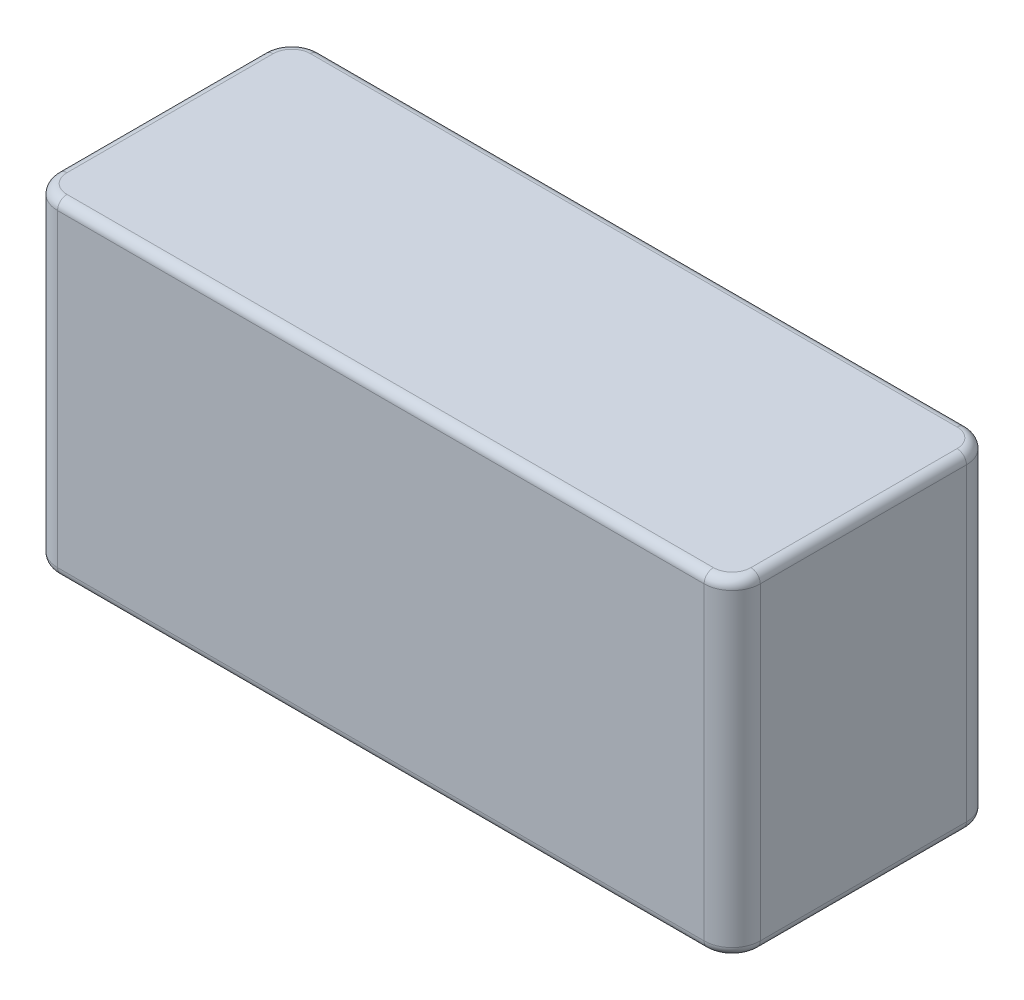
ISO-10303-21;
HEADER;
FILE_DESCRIPTION(('STEP AP214'),'2;1');
FILE_NAME('part.step','',(''),(''),'','','');
FILE_SCHEMA(('AUTOMOTIVE_DESIGN { 1 0 10303 214 1 1 1 1 }'));
ENDSEC;
DATA;
#1=APPLICATION_CONTEXT('core data for automotive mechanical design processes');
#2=APPLICATION_PROTOCOL_DEFINITION('international standard','automotive_design',2000,#1);
#3=PRODUCT_CONTEXT('',#1,'mechanical');
#4=PRODUCT('Part','Part','',(#3));
#5=PRODUCT_RELATED_PRODUCT_CATEGORY('part','',(#4));
#6=PRODUCT_DEFINITION_FORMATION('','',#4);
#7=PRODUCT_DEFINITION_CONTEXT('part definition',#1,'design');
#8=PRODUCT_DEFINITION('design','',#6,#7);
#9=PRODUCT_DEFINITION_SHAPE('','',#8);
#10=(LENGTH_UNIT() NAMED_UNIT(*) SI_UNIT(.MILLI.,.METRE.));
#11=(NAMED_UNIT(*) PLANE_ANGLE_UNIT() SI_UNIT($,.RADIAN.));
#12=(NAMED_UNIT(*) SI_UNIT($,.STERADIAN.) SOLID_ANGLE_UNIT());
#13=UNCERTAINTY_MEASURE_WITH_UNIT(LENGTH_MEASURE(1.E-05),#10,'distance_accuracy_value','');
#14=(GEOMETRIC_REPRESENTATION_CONTEXT(3) GLOBAL_UNCERTAINTY_ASSIGNED_CONTEXT((#13)) GLOBAL_UNIT_ASSIGNED_CONTEXT((#10,
#11,#12)) REPRESENTATION_CONTEXT('',''));
#15=CARTESIAN_POINT('',(0.,0.,0.));
#16=DIRECTION('',(0.,0.,1.));
#17=DIRECTION('',(1.,0.,0.));
#18=AXIS2_PLACEMENT_3D('',#15,#16,#17);
#19=CARTESIAN_POINT('',(37.5,35.,14.));
#20=DIRECTION('',(-1.,0.,0.));
#21=DIRECTION('',(0.,0.,1.));
#22=AXIS2_PLACEMENT_3D('',#19,#20,#21);
#23=PLANE('',#22);
#24=DIRECTION('',(0.,-1.,0.));
#25=VECTOR('',#24,1.);
#26=CARTESIAN_POINT('',(37.5,35.,-11.));
#27=LINE('',#26,#25);
#28=CARTESIAN_POINT('',(37.5,1.,-11.));
#29=VERTEX_POINT('',#28);
#30=CARTESIAN_POINT('',(37.5,34.,-11.));
#31=VERTEX_POINT('',#30);
#32=EDGE_CURVE('E180',#29,#31,#27,.F.);
#33=ORIENTED_EDGE('',*,*,#32,.T.);
#34=DIRECTION('',(0.,0.,-1.));
#35=VECTOR('',#34,1.);
#36=CARTESIAN_POINT('',(37.5,34.,14.));
#37=LINE('',#36,#35);
#38=CARTESIAN_POINT('',(37.5,34.,11.));
#39=VERTEX_POINT('',#38);
#40=EDGE_CURVE('E213',#31,#39,#37,.F.);
#41=ORIENTED_EDGE('',*,*,#40,.T.);
#42=DIRECTION('',(0.,-1.,0.));
#43=VECTOR('',#42,1.);
#44=CARTESIAN_POINT('',(37.5,35.,11.));
#45=LINE('',#44,#43);
#46=CARTESIAN_POINT('',(37.5,1.,11.));
#47=VERTEX_POINT('',#46);
#48=EDGE_CURVE('E353',#39,#47,#45,.T.);
#49=ORIENTED_EDGE('',*,*,#48,.T.);
#50=DIRECTION('',(0.,0.,-1.));
#51=VECTOR('',#50,1.);
#52=CARTESIAN_POINT('',(37.5,1.,-11.));
#53=LINE('',#52,#51);
#54=EDGE_CURVE('E210',#47,#29,#53,.T.);
#55=ORIENTED_EDGE('',*,*,#54,.T.);
#56=EDGE_LOOP('',(#33,#41,#49,#55));
#57=FACE_BOUND('',#56,.T.);
#58=ADVANCED_FACE('F44',(#57),#23,.F.);
#59=CARTESIAN_POINT('',(-37.5,35.,-14.));
#60=DIRECTION('',(0.,0.,1.));
#61=DIRECTION('',(1.,0.,0.));
#62=AXIS2_PLACEMENT_3D('',#59,#60,#61);
#63=PLANE('',#62);
#64=DIRECTION('',(0.,-1.,0.));
#65=VECTOR('',#64,1.);
#66=CARTESIAN_POINT('',(-34.5,35.,-14.));
#67=LINE('',#66,#65);
#68=CARTESIAN_POINT('',(-34.5,1.,-14.));
#69=VERTEX_POINT('',#68);
#70=CARTESIAN_POINT('',(-34.5,34.,-14.));
#71=VERTEX_POINT('',#70);
#72=EDGE_CURVE('E331',#69,#71,#67,.F.);
#73=ORIENTED_EDGE('',*,*,#72,.T.);
#74=DIRECTION('',(-1.,0.,0.));
#75=VECTOR('',#74,1.);
#76=CARTESIAN_POINT('',(-37.5,34.,-14.));
#77=LINE('',#76,#75);
#78=CARTESIAN_POINT('',(34.5,34.,-14.));
#79=VERTEX_POINT('',#78);
#80=EDGE_CURVE('E201',#71,#79,#77,.F.);
#81=ORIENTED_EDGE('',*,*,#80,.T.);
#82=DIRECTION('',(0.,-1.,0.));
#83=VECTOR('',#82,1.);
#84=CARTESIAN_POINT('',(34.5,35.,-14.));
#85=LINE('',#84,#83);
#86=CARTESIAN_POINT('',(34.5,1.,-14.));
#87=VERTEX_POINT('',#86);
#88=EDGE_CURVE('E342',#79,#87,#85,.T.);
#89=ORIENTED_EDGE('',*,*,#88,.T.);
#90=DIRECTION('',(-1.,0.,0.));
#91=VECTOR('',#90,1.);
#92=CARTESIAN_POINT('',(-34.5,1.,-14.));
#93=LINE('',#92,#91);
#94=EDGE_CURVE('E198',#87,#69,#93,.T.);
#95=ORIENTED_EDGE('',*,*,#94,.T.);
#96=EDGE_LOOP('',(#73,#81,#89,#95));
#97=FACE_BOUND('',#96,.T.);
#98=ADVANCED_FACE('F383',(#97),#63,.F.);
#99=CARTESIAN_POINT('',(-37.5,35.,14.));
#100=DIRECTION('',(1.,0.,0.));
#101=DIRECTION('',(0.,0.,-1.));
#102=AXIS2_PLACEMENT_3D('',#99,#100,#101);
#103=PLANE('',#102);
#104=DIRECTION('',(0.,-1.,0.));
#105=VECTOR('',#104,1.);
#106=CARTESIAN_POINT('',(-37.5,35.,11.));
#107=LINE('',#106,#105);
#108=CARTESIAN_POINT('',(-37.5,1.,11.));
#109=VERTEX_POINT('',#108);
#110=CARTESIAN_POINT('',(-37.5,34.,11.));
#111=VERTEX_POINT('',#110);
#112=EDGE_CURVE('E337',#109,#111,#107,.F.);
#113=ORIENTED_EDGE('',*,*,#112,.T.);
#114=DIRECTION('',(0.,0.,1.));
#115=VECTOR('',#114,1.);
#116=CARTESIAN_POINT('',(-37.5,34.,14.));
#117=LINE('',#116,#115);
#118=CARTESIAN_POINT('',(-37.5,34.,-11.));
#119=VERTEX_POINT('',#118);
#120=EDGE_CURVE('E238',#111,#119,#117,.F.);
#121=ORIENTED_EDGE('',*,*,#120,.T.);
#122=DIRECTION('',(0.,-1.,0.));
#123=VECTOR('',#122,1.);
#124=CARTESIAN_POINT('',(-37.5,35.,-11.));
#125=LINE('',#124,#123);
#126=CARTESIAN_POINT('',(-37.5,1.,-11.));
#127=VERTEX_POINT('',#126);
#128=EDGE_CURVE('E329',#119,#127,#125,.T.);
#129=ORIENTED_EDGE('',*,*,#128,.T.);
#130=DIRECTION('',(0.,0.,1.));
#131=VECTOR('',#130,1.);
#132=CARTESIAN_POINT('',(-37.5,1.,11.));
#133=LINE('',#132,#131);
#134=EDGE_CURVE('E235',#127,#109,#133,.T.);
#135=ORIENTED_EDGE('',*,*,#134,.T.);
#136=EDGE_LOOP('',(#113,#121,#129,#135));
#137=FACE_BOUND('',#136,.T.);
#138=ADVANCED_FACE('F334',(#137),#103,.F.);
#139=CARTESIAN_POINT('',(-37.5,35.,14.));
#140=DIRECTION('',(0.,0.,-1.));
#141=DIRECTION('',(-1.,0.,0.));
#142=AXIS2_PLACEMENT_3D('',#139,#140,#141);
#143=PLANE('',#142);
#144=DIRECTION('',(0.,-1.,0.));
#145=VECTOR('',#144,1.);
#146=CARTESIAN_POINT('',(34.5,35.,14.));
#147=LINE('',#146,#145);
#148=CARTESIAN_POINT('',(34.5,1.,14.));
#149=VERTEX_POINT('',#148);
#150=CARTESIAN_POINT('',(34.5,34.,14.));
#151=VERTEX_POINT('',#150);
#152=EDGE_CURVE('E284',#149,#151,#147,.F.);
#153=ORIENTED_EDGE('',*,*,#152,.T.);
#154=DIRECTION('',(1.,0.,0.));
#155=VECTOR('',#154,1.);
#156=CARTESIAN_POINT('',(-37.5,34.,14.));
#157=LINE('',#156,#155);
#158=CARTESIAN_POINT('',(-34.5,34.,14.));
#159=VERTEX_POINT('',#158);
#160=EDGE_CURVE('E226',#151,#159,#157,.F.);
#161=ORIENTED_EDGE('',*,*,#160,.T.);
#162=DIRECTION('',(0.,-1.,0.));
#163=VECTOR('',#162,1.);
#164=CARTESIAN_POINT('',(-34.5,35.,14.));
#165=LINE('',#164,#163);
#166=CARTESIAN_POINT('',(-34.5,1.,14.));
#167=VERTEX_POINT('',#166);
#168=EDGE_CURVE('E338',#159,#167,#165,.T.);
#169=ORIENTED_EDGE('',*,*,#168,.T.);
#170=DIRECTION('',(1.,0.,0.));
#171=VECTOR('',#170,1.);
#172=CARTESIAN_POINT('',(34.5,1.,14.));
#173=LINE('',#172,#171);
#174=EDGE_CURVE('E223',#167,#149,#173,.T.);
#175=ORIENTED_EDGE('',*,*,#174,.T.);
#176=EDGE_LOOP('',(#153,#161,#169,#175));
#177=FACE_BOUND('',#176,.T.);
#178=ADVANCED_FACE('F412',(#177),#143,.F.);
#179=CARTESIAN_POINT('',(0.,35.,0.));
#180=DIRECTION('',(0.,-1.,0.));
#181=DIRECTION('',(0.,0.,-1.));
#182=AXIS2_PLACEMENT_3D('',#179,#180,#181);
#183=PLANE('',#182);
#184=DIRECTION('',(-1.,0.,0.));
#185=VECTOR('',#184,1.);
#186=CARTESIAN_POINT('',(0.,35.,-13.));
#187=LINE('',#186,#185);
#188=CARTESIAN_POINT('',(34.5,35.,-13.));
#189=VERTEX_POINT('',#188);
#190=CARTESIAN_POINT('',(-34.5,35.,-13.));
#191=VERTEX_POINT('',#190);
#192=EDGE_CURVE('E184',#189,#191,#187,.T.);
#193=ORIENTED_EDGE('',*,*,#192,.T.);
#194=CARTESIAN_POINT('',(-34.5,35.,-11.));
#195=DIRECTION('',(0.,-1.,0.));
#196=DIRECTION('',(0.,0.,-1.));
#197=AXIS2_PLACEMENT_3D('',#194,#195,#196);
#198=CIRCLE('',#197,2.);
#199=CARTESIAN_POINT('',(-36.5,35.,-11.));
#200=VERTEX_POINT('',#199);
#201=EDGE_CURVE('E163',#191,#200,#198,.F.);
#202=ORIENTED_EDGE('',*,*,#201,.T.);
#203=DIRECTION('',(0.,0.,1.));
#204=VECTOR('',#203,1.);
#205=CARTESIAN_POINT('',(-36.5,35.,0.));
#206=LINE('',#205,#204);
#207=CARTESIAN_POINT('',(-36.5,35.,11.));
#208=VERTEX_POINT('',#207);
#209=EDGE_CURVE('E172',#200,#208,#206,.T.);
#210=ORIENTED_EDGE('',*,*,#209,.T.);
#211=CARTESIAN_POINT('',(-34.5,35.,11.));
#212=DIRECTION('',(0.,-1.,0.));
#213=DIRECTION('',(0.,0.,-1.));
#214=AXIS2_PLACEMENT_3D('',#211,#212,#213);
#215=CIRCLE('',#214,2.);
#216=CARTESIAN_POINT('',(-34.5,35.,13.));
#217=VERTEX_POINT('',#216);
#218=EDGE_CURVE('E179',#208,#217,#215,.F.);
#219=ORIENTED_EDGE('',*,*,#218,.T.);
#220=DIRECTION('',(1.,0.,0.));
#221=VECTOR('',#220,1.);
#222=CARTESIAN_POINT('',(0.,35.,13.));
#223=LINE('',#222,#221);
#224=CARTESIAN_POINT('',(34.5,35.,13.));
#225=VERTEX_POINT('',#224);
#226=EDGE_CURVE('E362',#217,#225,#223,.T.);
#227=ORIENTED_EDGE('',*,*,#226,.T.);
#228=CARTESIAN_POINT('',(34.5,35.,11.));
#229=DIRECTION('',(0.,-1.,0.));
#230=DIRECTION('',(0.,0.,-1.));
#231=AXIS2_PLACEMENT_3D('',#228,#229,#230);
#232=CIRCLE('',#231,2.);
#233=CARTESIAN_POINT('',(36.5,35.,11.));
#234=VERTEX_POINT('',#233);
#235=EDGE_CURVE('E365',#225,#234,#232,.F.);
#236=ORIENTED_EDGE('',*,*,#235,.T.);
#237=DIRECTION('',(0.,0.,-1.));
#238=VECTOR('',#237,1.);
#239=CARTESIAN_POINT('',(36.5,35.,0.));
#240=LINE('',#239,#238);
#241=CARTESIAN_POINT('',(36.5,35.,-11.));
#242=VERTEX_POINT('',#241);
#243=EDGE_CURVE('E368',#234,#242,#240,.T.);
#244=ORIENTED_EDGE('',*,*,#243,.T.);
#245=CARTESIAN_POINT('',(34.5,35.,-11.));
#246=DIRECTION('',(0.,-1.,0.));
#247=DIRECTION('',(0.,0.,-1.));
#248=AXIS2_PLACEMENT_3D('',#245,#246,#247);
#249=CIRCLE('',#248,2.);
#250=EDGE_CURVE('E192',#242,#189,#249,.F.);
#251=ORIENTED_EDGE('',*,*,#250,.T.);
#252=EDGE_LOOP('',(#193,#202,#210,#219,#227,#236,#244,#251));
#253=FACE_BOUND('',#252,.T.);
#254=ADVANCED_FACE('F182',(#253),#183,.F.);
#255=CARTESIAN_POINT('',(0.,0.,0.));
#256=DIRECTION('',(0.,-1.,0.));
#257=DIRECTION('',(0.,0.,-1.));
#258=AXIS2_PLACEMENT_3D('',#255,#256,#257);
#259=PLANE('',#258);
#260=DIRECTION('',(0.,0.,-1.));
#261=VECTOR('',#260,1.);
#262=CARTESIAN_POINT('',(36.5,0.,11.));
#263=LINE('',#262,#261);
#264=CARTESIAN_POINT('',(36.5,0.,-11.));
#265=VERTEX_POINT('',#264);
#266=CARTESIAN_POINT('',(36.5,0.,11.));
#267=VERTEX_POINT('',#266);
#268=EDGE_CURVE('E54',#265,#267,#263,.F.);
#269=ORIENTED_EDGE('',*,*,#268,.T.);
#270=CARTESIAN_POINT('',(34.5,0.,11.));
#271=DIRECTION('',(0.,-1.,0.));
#272=DIRECTION('',(0.,0.,-1.));
#273=AXIS2_PLACEMENT_3D('',#270,#271,#272);
#274=CIRCLE('',#273,2.);
#275=CARTESIAN_POINT('',(34.5,0.,13.));
#276=VERTEX_POINT('',#275);
#277=EDGE_CURVE('E11',#267,#276,#274,.T.);
#278=ORIENTED_EDGE('',*,*,#277,.T.);
#279=DIRECTION('',(1.,0.,0.));
#280=VECTOR('',#279,1.);
#281=CARTESIAN_POINT('',(-34.5,0.,13.));
#282=LINE('',#281,#280);
#283=CARTESIAN_POINT('',(-34.5,0.,13.));
#284=VERTEX_POINT('',#283);
#285=EDGE_CURVE('E241',#276,#284,#282,.F.);
#286=ORIENTED_EDGE('',*,*,#285,.T.);
#287=CARTESIAN_POINT('',(-34.5,0.,11.));
#288=DIRECTION('',(0.,-1.,0.));
#289=DIRECTION('',(0.,0.,-1.));
#290=AXIS2_PLACEMENT_3D('',#287,#288,#289);
#291=CIRCLE('',#290,2.);
#292=CARTESIAN_POINT('',(-36.5,0.,11.));
#293=VERTEX_POINT('',#292);
#294=EDGE_CURVE('E244',#284,#293,#291,.T.);
#295=ORIENTED_EDGE('',*,*,#294,.T.);
#296=DIRECTION('',(0.,0.,1.));
#297=VECTOR('',#296,1.);
#298=CARTESIAN_POINT('',(-36.5,0.,-11.));
#299=LINE('',#298,#297);
#300=CARTESIAN_POINT('',(-36.5,0.,-11.));
#301=VERTEX_POINT('',#300);
#302=EDGE_CURVE('E247',#293,#301,#299,.F.);
#303=ORIENTED_EDGE('',*,*,#302,.T.);
#304=CARTESIAN_POINT('',(-34.5,0.,-11.));
#305=DIRECTION('',(0.,-1.,0.));
#306=DIRECTION('',(0.,0.,-1.));
#307=AXIS2_PLACEMENT_3D('',#304,#305,#306);
#308=CIRCLE('',#307,2.);
#309=CARTESIAN_POINT('',(-34.5,0.,-13.));
#310=VERTEX_POINT('',#309);
#311=EDGE_CURVE('E250',#301,#310,#308,.T.);
#312=ORIENTED_EDGE('',*,*,#311,.T.);
#313=DIRECTION('',(-1.,0.,0.));
#314=VECTOR('',#313,1.);
#315=CARTESIAN_POINT('',(34.5,0.,-13.));
#316=LINE('',#315,#314);
#317=CARTESIAN_POINT('',(34.5,0.,-13.));
#318=VERTEX_POINT('',#317);
#319=EDGE_CURVE('E253',#310,#318,#316,.F.);
#320=ORIENTED_EDGE('',*,*,#319,.T.);
#321=CARTESIAN_POINT('',(34.5,0.,-11.));
#322=DIRECTION('',(0.,-1.,0.));
#323=DIRECTION('',(0.,0.,-1.));
#324=AXIS2_PLACEMENT_3D('',#321,#322,#323);
#325=CIRCLE('',#324,2.);
#326=EDGE_CURVE('E65',#318,#265,#325,.T.);
#327=ORIENTED_EDGE('',*,*,#326,.T.);
#328=EDGE_LOOP('',(#269,#278,#286,#295,#303,#312,#320,#327));
#329=FACE_BOUND('',#328,.T.);
#330=ADVANCED_FACE('F399',(#329),#259,.T.);
#331=CARTESIAN_POINT('',(-34.5,35.,11.));
#332=DIRECTION('',(0.,-1.,0.));
#333=DIRECTION('',(0.,0.,-1.));
#334=AXIS2_PLACEMENT_3D('',#331,#332,#333);
#335=CYLINDRICAL_SURFACE('',#334,3.);
#336=ORIENTED_EDGE('',*,*,#168,.F.);
#337=CARTESIAN_POINT('',(-34.5,34.,11.));
#338=DIRECTION('',(0.,-1.,0.));
#339=DIRECTION('',(0.,0.,-1.));
#340=AXIS2_PLACEMENT_3D('',#337,#338,#339);
#341=CIRCLE('',#340,3.);
#342=EDGE_CURVE('E232',#159,#111,#341,.T.);
#343=ORIENTED_EDGE('',*,*,#342,.T.);
#344=ORIENTED_EDGE('',*,*,#112,.F.);
#345=CARTESIAN_POINT('',(-34.5,1.,11.));
#346=DIRECTION('',(0.,-1.,0.));
#347=DIRECTION('',(0.,0.,-1.));
#348=AXIS2_PLACEMENT_3D('',#345,#346,#347);
#349=CIRCLE('',#348,3.);
#350=EDGE_CURVE('E229',#109,#167,#349,.F.);
#351=ORIENTED_EDGE('',*,*,#350,.T.);
#352=EDGE_LOOP('',(#336,#343,#344,#351));
#353=FACE_BOUND('',#352,.T.);
#354=ADVANCED_FACE('F437',(#353),#335,.T.);
#355=CARTESIAN_POINT('',(-34.5,35.,-11.));
#356=DIRECTION('',(0.,-1.,0.));
#357=DIRECTION('',(0.,0.,-1.));
#358=AXIS2_PLACEMENT_3D('',#355,#356,#357);
#359=CYLINDRICAL_SURFACE('',#358,3.);
#360=ORIENTED_EDGE('',*,*,#128,.F.);
#361=CARTESIAN_POINT('',(-34.5,34.,-11.));
#362=DIRECTION('',(0.,-1.,0.));
#363=DIRECTION('',(0.,0.,-1.));
#364=AXIS2_PLACEMENT_3D('',#361,#362,#363);
#365=CIRCLE('',#364,3.);
#366=EDGE_CURVE('E165',#119,#71,#365,.T.);
#367=ORIENTED_EDGE('',*,*,#366,.T.);
#368=ORIENTED_EDGE('',*,*,#72,.F.);
#369=CARTESIAN_POINT('',(-34.5,1.,-11.));
#370=DIRECTION('',(0.,-1.,0.));
#371=DIRECTION('',(0.,0.,-1.));
#372=AXIS2_PLACEMENT_3D('',#369,#370,#371);
#373=CIRCLE('',#372,3.);
#374=EDGE_CURVE('E187',#69,#127,#373,.F.);
#375=ORIENTED_EDGE('',*,*,#374,.T.);
#376=EDGE_LOOP('',(#360,#367,#368,#375));
#377=FACE_BOUND('',#376,.T.);
#378=ADVANCED_FACE('F328',(#377),#359,.T.);
#379=CARTESIAN_POINT('',(34.5,35.,-11.));
#380=DIRECTION('',(0.,-1.,0.));
#381=DIRECTION('',(0.,0.,-1.));
#382=AXIS2_PLACEMENT_3D('',#379,#380,#381);
#383=CYLINDRICAL_SURFACE('',#382,3.);
#384=ORIENTED_EDGE('',*,*,#88,.F.);
#385=CARTESIAN_POINT('',(34.5,34.,-11.));
#386=DIRECTION('',(0.,-1.,0.));
#387=DIRECTION('',(0.,0.,-1.));
#388=AXIS2_PLACEMENT_3D('',#385,#386,#387);
#389=CIRCLE('',#388,3.);
#390=EDGE_CURVE('E207',#79,#31,#389,.T.);
#391=ORIENTED_EDGE('',*,*,#390,.T.);
#392=ORIENTED_EDGE('',*,*,#32,.F.);
#393=CARTESIAN_POINT('',(34.5,1.,-11.));
#394=DIRECTION('',(0.,-1.,0.));
#395=DIRECTION('',(0.,0.,-1.));
#396=AXIS2_PLACEMENT_3D('',#393,#394,#395);
#397=CIRCLE('',#396,3.);
#398=EDGE_CURVE('E204',#29,#87,#397,.F.);
#399=ORIENTED_EDGE('',*,*,#398,.T.);
#400=EDGE_LOOP('',(#384,#391,#392,#399));
#401=FACE_BOUND('',#400,.T.);
#402=ADVANCED_FACE('F385',(#401),#383,.T.);
#403=CARTESIAN_POINT('',(34.5,35.,11.));
#404=DIRECTION('',(0.,-1.,0.));
#405=DIRECTION('',(0.,0.,-1.));
#406=AXIS2_PLACEMENT_3D('',#403,#404,#405);
#407=CYLINDRICAL_SURFACE('',#406,3.);
#408=ORIENTED_EDGE('',*,*,#48,.F.);
#409=CARTESIAN_POINT('',(34.5,34.,11.));
#410=DIRECTION('',(0.,-1.,0.));
#411=DIRECTION('',(0.,0.,-1.));
#412=AXIS2_PLACEMENT_3D('',#409,#410,#411);
#413=CIRCLE('',#412,3.);
#414=EDGE_CURVE('E220',#39,#151,#413,.T.);
#415=ORIENTED_EDGE('',*,*,#414,.T.);
#416=ORIENTED_EDGE('',*,*,#152,.F.);
#417=CARTESIAN_POINT('',(34.5,1.,11.));
#418=DIRECTION('',(0.,-1.,0.));
#419=DIRECTION('',(0.,0.,-1.));
#420=AXIS2_PLACEMENT_3D('',#417,#418,#419);
#421=CIRCLE('',#420,3.);
#422=EDGE_CURVE('E216',#149,#47,#421,.F.);
#423=ORIENTED_EDGE('',*,*,#422,.T.);
#424=EDGE_LOOP('',(#408,#415,#416,#423));
#425=FACE_BOUND('',#424,.T.);
#426=ADVANCED_FACE('F417',(#425),#407,.T.);
#427=CARTESIAN_POINT('',(34.5,34.,11.));
#428=DIRECTION('',(0.,-1.,0.));
#429=DIRECTION('',(0.,0.,-1.));
#430=AXIS2_PLACEMENT_3D('',#427,#428,#429);
#431=TOROIDAL_SURFACE('',#430,2.,1.);
#432=CARTESIAN_POINT('',(34.5,34.,13.));
#433=DIRECTION('',(-1.,0.,0.));
#434=DIRECTION('',(0.,0.,1.));
#435=AXIS2_PLACEMENT_3D('',#432,#433,#434);
#436=CIRCLE('',#435,1.);
#437=EDGE_CURVE('E276',#151,#225,#436,.T.);
#438=ORIENTED_EDGE('',*,*,#437,.F.);
#439=ORIENTED_EDGE('',*,*,#414,.F.);
#440=CARTESIAN_POINT('',(36.5,34.,11.));
#441=DIRECTION('',(0.,0.,-1.));
#442=DIRECTION('',(-1.,0.,0.));
#443=AXIS2_PLACEMENT_3D('',#440,#441,#442);
#444=CIRCLE('',#443,1.);
#445=EDGE_CURVE('E280',#234,#39,#444,.T.);
#446=ORIENTED_EDGE('',*,*,#445,.F.);
#447=ORIENTED_EDGE('',*,*,#235,.F.);
#448=EDGE_LOOP('',(#438,#439,#446,#447));
#449=FACE_BOUND('',#448,.T.);
#450=ADVANCED_FACE('F422',(#449),#431,.T.);
#451=CARTESIAN_POINT('',(36.5,34.,0.));
#452=DIRECTION('',(0.,0.,-1.));
#453=DIRECTION('',(-1.,0.,0.));
#454=AXIS2_PLACEMENT_3D('',#451,#452,#453);
#455=CYLINDRICAL_SURFACE('',#454,1.);
#456=ORIENTED_EDGE('',*,*,#445,.T.);
#457=ORIENTED_EDGE('',*,*,#40,.F.);
#458=CARTESIAN_POINT('',(36.5,34.,-11.));
#459=DIRECTION('',(0.,0.,-1.));
#460=DIRECTION('',(-1.,0.,0.));
#461=AXIS2_PLACEMENT_3D('',#458,#459,#460);
#462=CIRCLE('',#461,1.);
#463=EDGE_CURVE('E272',#242,#31,#462,.T.);
#464=ORIENTED_EDGE('',*,*,#463,.F.);
#465=ORIENTED_EDGE('',*,*,#243,.F.);
#466=EDGE_LOOP('',(#456,#457,#464,#465));
#467=FACE_BOUND('',#466,.T.);
#468=ADVANCED_FACE('F427',(#467),#455,.T.);
#469=CARTESIAN_POINT('',(0.,34.,13.));
#470=DIRECTION('',(1.,0.,0.));
#471=DIRECTION('',(0.,0.,-1.));
#472=AXIS2_PLACEMENT_3D('',#469,#470,#471);
#473=CYLINDRICAL_SURFACE('',#472,1.);
#474=ORIENTED_EDGE('',*,*,#437,.T.);
#475=ORIENTED_EDGE('',*,*,#226,.F.);
#476=CARTESIAN_POINT('',(-34.5,34.,13.));
#477=DIRECTION('',(-1.,0.,0.));
#478=DIRECTION('',(0.,0.,1.));
#479=AXIS2_PLACEMENT_3D('',#476,#477,#478);
#480=CIRCLE('',#479,1.);
#481=EDGE_CURVE('E268',#159,#217,#480,.T.);
#482=ORIENTED_EDGE('',*,*,#481,.F.);
#483=ORIENTED_EDGE('',*,*,#160,.F.);
#484=EDGE_LOOP('',(#474,#475,#482,#483));
#485=FACE_BOUND('',#484,.T.);
#486=ADVANCED_FACE('F459',(#485),#473,.T.);
#487=CARTESIAN_POINT('',(34.5,34.,-11.));
#488=DIRECTION('',(0.,-1.,0.));
#489=DIRECTION('',(0.,0.,-1.));
#490=AXIS2_PLACEMENT_3D('',#487,#488,#489);
#491=TOROIDAL_SURFACE('',#490,2.,1.);
#492=ORIENTED_EDGE('',*,*,#463,.T.);
#493=ORIENTED_EDGE('',*,*,#390,.F.);
#494=CARTESIAN_POINT('',(34.5,34.,-13.));
#495=DIRECTION('',(-1.,0.,0.));
#496=DIRECTION('',(0.,0.,1.));
#497=AXIS2_PLACEMENT_3D('',#494,#495,#496);
#498=CIRCLE('',#497,1.);
#499=EDGE_CURVE('E264',#189,#79,#498,.T.);
#500=ORIENTED_EDGE('',*,*,#499,.F.);
#501=ORIENTED_EDGE('',*,*,#250,.F.);
#502=EDGE_LOOP('',(#492,#493,#500,#501));
#503=FACE_BOUND('',#502,.T.);
#504=ADVANCED_FACE('F377',(#503),#491,.T.);
#505=CARTESIAN_POINT('',(-34.5,34.,11.));
#506=DIRECTION('',(0.,-1.,0.));
#507=DIRECTION('',(0.,0.,-1.));
#508=AXIS2_PLACEMENT_3D('',#505,#506,#507);
#509=TOROIDAL_SURFACE('',#508,2.,1.);
#510=ORIENTED_EDGE('',*,*,#481,.T.);
#511=ORIENTED_EDGE('',*,*,#218,.F.);
#512=CARTESIAN_POINT('',(-36.5,34.,11.));
#513=DIRECTION('',(0.,0.,-1.));
#514=DIRECTION('',(-1.,0.,0.));
#515=AXIS2_PLACEMENT_3D('',#512,#513,#514);
#516=CIRCLE('',#515,1.);
#517=EDGE_CURVE('E175',#111,#208,#516,.T.);
#518=ORIENTED_EDGE('',*,*,#517,.F.);
#519=ORIENTED_EDGE('',*,*,#342,.F.);
#520=EDGE_LOOP('',(#510,#511,#518,#519));
#521=FACE_BOUND('',#520,.T.);
#522=ADVANCED_FACE('F453',(#521),#509,.T.);
#523=CARTESIAN_POINT('',(0.,34.,-13.));
#524=DIRECTION('',(-1.,0.,0.));
#525=DIRECTION('',(0.,0.,1.));
#526=AXIS2_PLACEMENT_3D('',#523,#524,#525);
#527=CYLINDRICAL_SURFACE('',#526,1.);
#528=ORIENTED_EDGE('',*,*,#499,.T.);
#529=ORIENTED_EDGE('',*,*,#80,.F.);
#530=CARTESIAN_POINT('',(-34.5,34.,-13.));
#531=DIRECTION('',(-1.,0.,0.));
#532=DIRECTION('',(0.,0.,1.));
#533=AXIS2_PLACEMENT_3D('',#530,#531,#532);
#534=CIRCLE('',#533,1.);
#535=EDGE_CURVE('E169',#191,#71,#534,.T.);
#536=ORIENTED_EDGE('',*,*,#535,.F.);
#537=ORIENTED_EDGE('',*,*,#192,.F.);
#538=EDGE_LOOP('',(#528,#529,#536,#537));
#539=FACE_BOUND('',#538,.T.);
#540=ADVANCED_FACE('F380',(#539),#527,.T.);
#541=CARTESIAN_POINT('',(-36.5,34.,0.));
#542=DIRECTION('',(0.,0.,1.));
#543=DIRECTION('',(1.,0.,0.));
#544=AXIS2_PLACEMENT_3D('',#541,#542,#543);
#545=CYLINDRICAL_SURFACE('',#544,1.);
#546=ORIENTED_EDGE('',*,*,#517,.T.);
#547=ORIENTED_EDGE('',*,*,#209,.F.);
#548=CARTESIAN_POINT('',(-36.5,34.,-11.));
#549=DIRECTION('',(0.,0.,-1.));
#550=DIRECTION('',(-1.,0.,0.));
#551=AXIS2_PLACEMENT_3D('',#548,#549,#550);
#552=CIRCLE('',#551,1.);
#553=EDGE_CURVE('E159',#119,#200,#552,.T.);
#554=ORIENTED_EDGE('',*,*,#553,.F.);
#555=ORIENTED_EDGE('',*,*,#120,.F.);
#556=EDGE_LOOP('',(#546,#547,#554,#555));
#557=FACE_BOUND('',#556,.T.);
#558=ADVANCED_FACE('F173',(#557),#545,.T.);
#559=CARTESIAN_POINT('',(-34.5,34.,-11.));
#560=DIRECTION('',(0.,-1.,0.));
#561=DIRECTION('',(0.,0.,-1.));
#562=AXIS2_PLACEMENT_3D('',#559,#560,#561);
#563=TOROIDAL_SURFACE('',#562,2.,1.);
#564=ORIENTED_EDGE('',*,*,#535,.T.);
#565=ORIENTED_EDGE('',*,*,#366,.F.);
#566=ORIENTED_EDGE('',*,*,#553,.T.);
#567=ORIENTED_EDGE('',*,*,#201,.F.);
#568=EDGE_LOOP('',(#564,#565,#566,#567));
#569=FACE_BOUND('',#568,.T.);
#570=ADVANCED_FACE('F161',(#569),#563,.T.);
#571=CARTESIAN_POINT('',(-34.5,1.,-11.));
#572=DIRECTION('',(0.,-1.,0.));
#573=DIRECTION('',(0.,0.,-1.));
#574=AXIS2_PLACEMENT_3D('',#571,#572,#573);
#575=TOROIDAL_SURFACE('',#574,2.,1.);
#576=CARTESIAN_POINT('',(-36.5,1.,-11.));
#577=DIRECTION('',(0.,0.,1.));
#578=DIRECTION('',(1.,0.,0.));
#579=AXIS2_PLACEMENT_3D('',#576,#577,#578);
#580=CIRCLE('',#579,1.);
#581=EDGE_CURVE('E306',#127,#301,#580,.T.);
#582=ORIENTED_EDGE('',*,*,#581,.F.);
#583=ORIENTED_EDGE('',*,*,#374,.F.);
#584=CARTESIAN_POINT('',(-34.5,1.,-13.));
#585=DIRECTION('',(1.,0.,0.));
#586=DIRECTION('',(0.,0.,-1.));
#587=AXIS2_PLACEMENT_3D('',#584,#585,#586);
#588=CIRCLE('',#587,1.);
#589=EDGE_CURVE('E48',#310,#69,#588,.T.);
#590=ORIENTED_EDGE('',*,*,#589,.F.);
#591=ORIENTED_EDGE('',*,*,#311,.F.);
#592=EDGE_LOOP('',(#582,#583,#590,#591));
#593=FACE_BOUND('',#592,.T.);
#594=ADVANCED_FACE('F46',(#593),#575,.T.);
#595=CARTESIAN_POINT('',(-37.5,1.,-13.));
#596=DIRECTION('',(1.,0.,0.));
#597=DIRECTION('',(0.,0.,-1.));
#598=AXIS2_PLACEMENT_3D('',#595,#596,#597);
#599=CYLINDRICAL_SURFACE('',#598,1.);
#600=ORIENTED_EDGE('',*,*,#589,.T.);
#601=ORIENTED_EDGE('',*,*,#94,.F.);
#602=CARTESIAN_POINT('',(34.5,1.,-13.));
#603=DIRECTION('',(1.,0.,0.));
#604=DIRECTION('',(0.,0.,-1.));
#605=AXIS2_PLACEMENT_3D('',#602,#603,#604);
#606=CIRCLE('',#605,1.);
#607=EDGE_CURVE('E303',#318,#87,#606,.T.);
#608=ORIENTED_EDGE('',*,*,#607,.F.);
#609=ORIENTED_EDGE('',*,*,#319,.F.);
#610=EDGE_LOOP('',(#600,#601,#608,#609));
#611=FACE_BOUND('',#610,.T.);
#612=ADVANCED_FACE('F319',(#611),#599,.T.);
#613=CARTESIAN_POINT('',(-36.5,1.,14.));
#614=DIRECTION('',(0.,0.,-1.));
#615=DIRECTION('',(-1.,0.,0.));
#616=AXIS2_PLACEMENT_3D('',#613,#614,#615);
#617=CYLINDRICAL_SURFACE('',#616,1.);
#618=ORIENTED_EDGE('',*,*,#581,.T.);
#619=ORIENTED_EDGE('',*,*,#302,.F.);
#620=CARTESIAN_POINT('',(-36.5,1.,11.));
#621=DIRECTION('',(0.,0.,1.));
#622=DIRECTION('',(1.,0.,0.));
#623=AXIS2_PLACEMENT_3D('',#620,#621,#622);
#624=CIRCLE('',#623,1.);
#625=EDGE_CURVE('E299',#109,#293,#624,.T.);
#626=ORIENTED_EDGE('',*,*,#625,.F.);
#627=ORIENTED_EDGE('',*,*,#134,.F.);
#628=EDGE_LOOP('',(#618,#619,#626,#627));
#629=FACE_BOUND('',#628,.T.);
#630=ADVANCED_FACE('F477',(#629),#617,.T.);
#631=CARTESIAN_POINT('',(34.5,1.,-11.));
#632=DIRECTION('',(0.,-1.,0.));
#633=DIRECTION('',(0.,0.,-1.));
#634=AXIS2_PLACEMENT_3D('',#631,#632,#633);
#635=TOROIDAL_SURFACE('',#634,2.,1.);
#636=ORIENTED_EDGE('',*,*,#607,.T.);
#637=ORIENTED_EDGE('',*,*,#398,.F.);
#638=CARTESIAN_POINT('',(36.5,1.,-11.));
#639=DIRECTION('',(0.,0.,1.));
#640=DIRECTION('',(1.,0.,0.));
#641=AXIS2_PLACEMENT_3D('',#638,#639,#640);
#642=CIRCLE('',#641,1.);
#643=EDGE_CURVE('E295',#265,#29,#642,.T.);
#644=ORIENTED_EDGE('',*,*,#643,.F.);
#645=ORIENTED_EDGE('',*,*,#326,.F.);
#646=EDGE_LOOP('',(#636,#637,#644,#645));
#647=FACE_BOUND('',#646,.T.);
#648=ADVANCED_FACE('F389',(#647),#635,.T.);
#649=CARTESIAN_POINT('',(-34.5,1.,11.));
#650=DIRECTION('',(0.,-1.,0.));
#651=DIRECTION('',(0.,0.,-1.));
#652=AXIS2_PLACEMENT_3D('',#649,#650,#651);
#653=TOROIDAL_SURFACE('',#652,2.,1.);
#654=ORIENTED_EDGE('',*,*,#625,.T.);
#655=ORIENTED_EDGE('',*,*,#294,.F.);
#656=CARTESIAN_POINT('',(-34.5,1.,13.));
#657=DIRECTION('',(1.,0.,0.));
#658=DIRECTION('',(0.,0.,-1.));
#659=AXIS2_PLACEMENT_3D('',#656,#657,#658);
#660=CIRCLE('',#659,1.);
#661=EDGE_CURVE('E291',#167,#284,#660,.T.);
#662=ORIENTED_EDGE('',*,*,#661,.F.);
#663=ORIENTED_EDGE('',*,*,#350,.F.);
#664=EDGE_LOOP('',(#654,#655,#662,#663));
#665=FACE_BOUND('',#664,.T.);
#666=ADVANCED_FACE('F404',(#665),#653,.T.);
#667=CARTESIAN_POINT('',(36.5,1.,14.));
#668=DIRECTION('',(0.,0.,1.));
#669=DIRECTION('',(1.,0.,0.));
#670=AXIS2_PLACEMENT_3D('',#667,#668,#669);
#671=CYLINDRICAL_SURFACE('',#670,1.);
#672=ORIENTED_EDGE('',*,*,#643,.T.);
#673=ORIENTED_EDGE('',*,*,#54,.F.);
#674=CARTESIAN_POINT('',(36.5,1.,11.));
#675=DIRECTION('',(0.,0.,1.));
#676=DIRECTION('',(1.,0.,0.));
#677=AXIS2_PLACEMENT_3D('',#674,#675,#676);
#678=CIRCLE('',#677,1.);
#679=EDGE_CURVE('E288',#267,#47,#678,.T.);
#680=ORIENTED_EDGE('',*,*,#679,.F.);
#681=ORIENTED_EDGE('',*,*,#268,.F.);
#682=EDGE_LOOP('',(#672,#673,#680,#681));
#683=FACE_BOUND('',#682,.T.);
#684=ADVANCED_FACE('F392',(#683),#671,.T.);
#685=CARTESIAN_POINT('',(-37.5,1.,13.));
#686=DIRECTION('',(-1.,0.,0.));
#687=DIRECTION('',(0.,0.,1.));
#688=AXIS2_PLACEMENT_3D('',#685,#686,#687);
#689=CYLINDRICAL_SURFACE('',#688,1.);
#690=ORIENTED_EDGE('',*,*,#661,.T.);
#691=ORIENTED_EDGE('',*,*,#285,.F.);
#692=CARTESIAN_POINT('',(34.5,1.,13.));
#693=DIRECTION('',(1.,0.,0.));
#694=DIRECTION('',(0.,0.,-1.));
#695=AXIS2_PLACEMENT_3D('',#692,#693,#694);
#696=CIRCLE('',#695,1.);
#697=EDGE_CURVE('E285',#149,#276,#696,.T.);
#698=ORIENTED_EDGE('',*,*,#697,.F.);
#699=ORIENTED_EDGE('',*,*,#174,.F.);
#700=EDGE_LOOP('',(#690,#691,#698,#699));
#701=FACE_BOUND('',#700,.T.);
#702=ADVANCED_FACE('F408',(#701),#689,.T.);
#703=CARTESIAN_POINT('',(34.5,1.,11.));
#704=DIRECTION('',(0.,-1.,0.));
#705=DIRECTION('',(0.,0.,-1.));
#706=AXIS2_PLACEMENT_3D('',#703,#704,#705);
#707=TOROIDAL_SURFACE('',#706,2.,1.);
#708=ORIENTED_EDGE('',*,*,#679,.T.);
#709=ORIENTED_EDGE('',*,*,#422,.F.);
#710=ORIENTED_EDGE('',*,*,#697,.T.);
#711=ORIENTED_EDGE('',*,*,#277,.F.);
#712=EDGE_LOOP('',(#708,#709,#710,#711));
#713=FACE_BOUND('',#712,.T.);
#714=ADVANCED_FACE('F396',(#713),#707,.T.);
#715=CLOSED_SHELL('',(#58,#98,#138,#178,#254,#330,#354,#378,#402,#426,#450,#468,#486,#504,#522,
#540,#558,#570,#594,#612,#630,#648,#666,#684,#702,#714));
#716=MANIFOLD_SOLID_BREP('B2',#715);
#717=ADVANCED_BREP_SHAPE_REPRESENTATION('',(#18,#716),#14);
#718=SHAPE_DEFINITION_REPRESENTATION(#9,#717);
ENDSEC;
END-ISO-10303-21;
